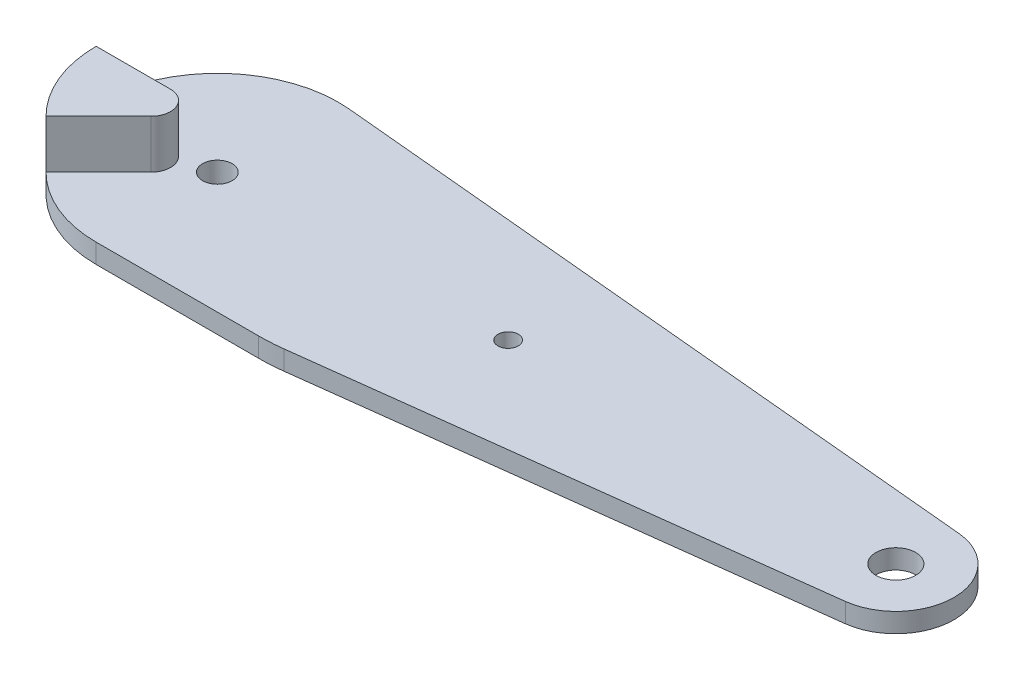
ISO-10303-21;
HEADER;
FILE_DESCRIPTION(('STEP AP214'),'2;1');
FILE_NAME('part.step','',(''),(''),'','','');
FILE_SCHEMA(('AUTOMOTIVE_DESIGN { 1 0 10303 214 1 1 1 1 }'));
ENDSEC;
DATA;
#1=APPLICATION_CONTEXT('core data for automotive mechanical design processes');
#2=APPLICATION_PROTOCOL_DEFINITION('international standard','automotive_design',2000,#1);
#3=PRODUCT_CONTEXT('',#1,'mechanical');
#4=PRODUCT('Part','Part','',(#3));
#5=PRODUCT_RELATED_PRODUCT_CATEGORY('part','',(#4));
#6=PRODUCT_DEFINITION_FORMATION('','',#4);
#7=PRODUCT_DEFINITION_CONTEXT('part definition',#1,'design');
#8=PRODUCT_DEFINITION('design','',#6,#7);
#9=PRODUCT_DEFINITION_SHAPE('','',#8);
#10=(LENGTH_UNIT() NAMED_UNIT(*) SI_UNIT(.MILLI.,.METRE.));
#11=(NAMED_UNIT(*) PLANE_ANGLE_UNIT() SI_UNIT($,.RADIAN.));
#12=(NAMED_UNIT(*) SI_UNIT($,.STERADIAN.) SOLID_ANGLE_UNIT());
#13=UNCERTAINTY_MEASURE_WITH_UNIT(LENGTH_MEASURE(1.E-05),#10,'distance_accuracy_value','');
#14=(GEOMETRIC_REPRESENTATION_CONTEXT(3) GLOBAL_UNCERTAINTY_ASSIGNED_CONTEXT((#13)) GLOBAL_UNIT_ASSIGNED_CONTEXT((#10,
#11,#12)) REPRESENTATION_CONTEXT('',''));
#15=CARTESIAN_POINT('',(0.,0.,0.));
#16=DIRECTION('',(0.,0.,1.));
#17=DIRECTION('',(1.,0.,0.));
#18=AXIS2_PLACEMENT_3D('',#15,#16,#17);
#19=CARTESIAN_POINT('',(0.,0.,0.));
#20=DIRECTION('',(0.,1.,0.));
#21=DIRECTION('',(0.,0.,1.));
#22=AXIS2_PLACEMENT_3D('',#19,#20,#21);
#23=PLANE('',#22);
#24=CARTESIAN_POINT('',(0.,0.,0.));
#25=DIRECTION('',(0.,1.,0.));
#26=DIRECTION('',(0.,0.,1.));
#27=AXIS2_PLACEMENT_3D('',#24,#25,#26);
#28=CIRCLE('',#27,3.05);
#29=CARTESIAN_POINT('',(0.,0.,3.05));
#30=VERTEX_POINT('',#29);
#31=EDGE_CURVE('E205',#30,#30,#28,.T.);
#32=ORIENTED_EDGE('',*,*,#31,.T.);
#33=EDGE_LOOP('',(#32));
#34=FACE_BOUND('',#33,.T.);
#35=CARTESIAN_POINT('',(0.,0.,0.));
#36=DIRECTION('',(0.,1.,0.));
#37=DIRECTION('',(0.,0.,1.));
#38=AXIS2_PLACEMENT_3D('',#35,#36,#37);
#39=CIRCLE('',#38,12.5);
#40=CARTESIAN_POINT('',(5.93717104351897,0.,11.));
#41=VERTEX_POINT('',#40);
#42=CARTESIAN_POINT('',(5.93717104351896,0.,-11.));
#43=VERTEX_POINT('',#42);
#44=EDGE_CURVE('E201',#41,#43,#39,.T.);
#45=ORIENTED_EDGE('',*,*,#44,.F.);
#46=DIRECTION('',(1.,0.,0.));
#47=VECTOR('',#46,1.);
#48=CARTESIAN_POINT('',(0.,0.,11.));
#49=LINE('',#48,#47);
#50=CARTESIAN_POINT('',(-5.93717104351897,0.,11.));
#51=VERTEX_POINT('',#50);
#52=EDGE_CURVE('E188',#51,#41,#49,.T.);
#53=ORIENTED_EDGE('',*,*,#52,.F.);
#54=CARTESIAN_POINT('',(-5.93717104351896,0.,-11.));
#55=VERTEX_POINT('',#54);
#56=EDGE_CURVE('E199',#55,#51,#39,.T.);
#57=ORIENTED_EDGE('',*,*,#56,.F.);
#58=DIRECTION('',(1.,0.,0.));
#59=VECTOR('',#58,1.);
#60=CARTESIAN_POINT('',(0.,0.,-11.));
#61=LINE('',#60,#59);
#62=EDGE_CURVE('E448',#55,#43,#61,.T.);
#63=ORIENTED_EDGE('',*,*,#62,.T.);
#64=EDGE_LOOP('',(#45,#53,#57,#63));
#65=FACE_BOUND('',#64,.T.);
#66=ADVANCED_FACE('F83',(#34,#65),#23,.F.);
#67=CARTESIAN_POINT('',(0.,8.,0.));
#68=DIRECTION('',(0.,-1.,0.));
#69=DIRECTION('',(0.,0.,-1.));
#70=AXIS2_PLACEMENT_3D('',#67,#68,#69);
#71=CYLINDRICAL_SURFACE('',#70,12.5);
#72=CARTESIAN_POINT('',(0.,6.,0.));
#73=DIRECTION('',(0.,-1.,0.));
#74=DIRECTION('',(0.,0.,-1.));
#75=AXIS2_PLACEMENT_3D('',#72,#73,#74);
#76=CIRCLE('',#75,12.5);
#77=CARTESIAN_POINT('',(5.93717104351896,6.,-11.));
#78=VERTEX_POINT('',#77);
#79=CARTESIAN_POINT('',(5.93717104351897,6.,11.));
#80=VERTEX_POINT('',#79);
#81=EDGE_CURVE('E374',#78,#80,#76,.T.);
#82=ORIENTED_EDGE('',*,*,#81,.T.);
#83=DIRECTION('',(0.,-1.,0.));
#84=VECTOR('',#83,1.);
#85=CARTESIAN_POINT('',(5.93717104351897,17.9687092035858,11.));
#86=LINE('',#85,#84);
#87=EDGE_CURVE('E193',#80,#41,#86,.T.);
#88=ORIENTED_EDGE('',*,*,#87,.T.);
#89=ORIENTED_EDGE('',*,*,#44,.T.);
#90=DIRECTION('',(0.,-1.,0.));
#91=VECTOR('',#90,1.);
#92=CARTESIAN_POINT('',(5.93717104351897,17.9687092035858,-11.));
#93=LINE('',#92,#91);
#94=EDGE_CURVE('E447',#78,#43,#93,.T.);
#95=ORIENTED_EDGE('',*,*,#94,.F.);
#96=EDGE_LOOP('',(#82,#88,#89,#95));
#97=FACE_BOUND('',#96,.T.);
#98=ADVANCED_FACE('F300',(#97),#71,.T.);
#99=ORIENTED_EDGE('',*,*,#56,.T.);
#100=DIRECTION('',(0.,-1.,0.));
#101=VECTOR('',#100,1.);
#102=CARTESIAN_POINT('',(-5.93717104351896,17.9687092035858,11.));
#103=LINE('',#102,#101);
#104=CARTESIAN_POINT('',(-5.93717104351897,6.,11.));
#105=VERTEX_POINT('',#104);
#106=EDGE_CURVE('E184',#105,#51,#103,.T.);
#107=ORIENTED_EDGE('',*,*,#106,.F.);
#108=CARTESIAN_POINT('',(-5.93717104351896,6.,-11.));
#109=VERTEX_POINT('',#108);
#110=EDGE_CURVE('E373',#105,#109,#76,.T.);
#111=ORIENTED_EDGE('',*,*,#110,.T.);
#112=DIRECTION('',(0.,-1.,0.));
#113=VECTOR('',#112,1.);
#114=CARTESIAN_POINT('',(-5.93717104351896,17.9687092035858,-11.));
#115=LINE('',#114,#113);
#116=EDGE_CURVE('E99',#109,#55,#115,.T.);
#117=ORIENTED_EDGE('',*,*,#116,.T.);
#118=EDGE_LOOP('',(#99,#107,#111,#117));
#119=FACE_BOUND('',#118,.T.);
#120=ADVANCED_FACE('F204',(#119),#71,.T.);
#121=CARTESIAN_POINT('',(0.,3.3,-12.5));
#122=DIRECTION('',(0.,0.,1.));
#123=DIRECTION('',(1.,0.,0.));
#124=AXIS2_PLACEMENT_3D('',#121,#122,#123);
#125=CYLINDRICAL_SURFACE('',#124,1.6);
#126=CARTESIAN_POINT('',(0.,4.9,-3.05));
#127=CARTESIAN_POINT('',(-0.0836110050453581,4.89999455650102,-3.04999517700509));
#128=CARTESIAN_POINT('',(-0.167306428380569,4.89340785872216,-3.04652589814843));
#129=CARTESIAN_POINT('',(-0.332191821665101,4.86736761047759,-3.03298901559862));
#130=CARTESIAN_POINT('',(-0.41337744453983,4.84789291591933,-3.02291056912914));
#131=CARTESIAN_POINT('',(-0.570613153127324,4.79706399807992,-2.99720260155738));
#132=CARTESIAN_POINT('',(-0.64668239885405,4.76575738147327,-2.98159534164387));
#133=CARTESIAN_POINT('',(-0.792357900481189,4.69241738866397,-2.94623419512776));
#134=CARTESIAN_POINT('',(-0.861964263345972,4.65038419003549,-2.92648037717069));
#135=CARTESIAN_POINT('',(-0.997798318782131,4.55371076067794,-2.88310679073146));
#136=CARTESIAN_POINT('',(-1.06351666988197,4.49843117858787,-2.859319653945));
#137=CARTESIAN_POINT('',(-1.18522587445246,4.37822360035397,-2.81105572902165));
#138=CARTESIAN_POINT('',(-1.24120850706307,4.31328753525379,-2.78657837813787));
#139=CARTESIAN_POINT('',(-1.3467876012229,4.16882083429099,-2.73721560194913));
#140=CARTESIAN_POINT('',(-1.39539667719393,4.08851034451157,-2.71248186972032));
#141=CARTESIAN_POINT('',(-1.47821785577007,3.91944545804245,-2.66825595257666));
#142=CARTESIAN_POINT('',(-1.51244089981633,3.83069754174642,-2.64875978826508));
#143=CARTESIAN_POINT('',(-1.56317686282866,3.65282461369515,-2.61912187860583));
#144=CARTESIAN_POINT('',(-1.5806560469441,3.56406395204097,-2.60847521031483));
#145=CARTESIAN_POINT('',(-1.60032679539884,3.38428674524895,-2.59645976696876));
#146=CARTESIAN_POINT('',(-1.60253644934951,3.29327299770229,-2.59508001357605));
#147=CARTESIAN_POINT('',(-1.59231112345977,3.12481316320863,-2.60135681056238));
#148=CARTESIAN_POINT('',(-1.58181195806415,3.04719343145767,-2.60781918576659));
#149=CARTESIAN_POINT('',(-1.54985517155484,2.89503685895057,-2.62693591844801));
#150=CARTESIAN_POINT('',(-1.52839341169479,2.82050119402981,-2.63959261441304));
#151=CARTESIAN_POINT('',(-1.47477217782312,2.67451021239191,-2.66992681382473));
#152=CARTESIAN_POINT('',(-1.44237993660731,2.60316388490232,-2.68771221954179));
#153=CARTESIAN_POINT('',(-1.36800477135078,2.46656234914093,-2.7263193459757));
#154=CARTESIAN_POINT('',(-1.32601756253087,2.40130988056908,-2.74714242170351));
#155=CARTESIAN_POINT('',(-1.22673326593071,2.26903155683991,-2.79303030943981));
#156=CARTESIAN_POINT('',(-1.16811065163519,2.20306057289718,-2.81827847110633));
#157=CARTESIAN_POINT('',(-1.04059337899233,2.08142080073434,-2.86781214667249));
#158=CARTESIAN_POINT('',(-0.971692869974616,2.02575792109897,-2.89209710223632));
#159=CARTESIAN_POINT('',(-0.820740647513362,1.9233543393171,-2.93861464263574));
#160=CARTESIAN_POINT('',(-0.738169212285077,1.87728596283712,-2.96065672738557));
#161=CARTESIAN_POINT('',(-0.565004905102359,1.80008897506982,-2.99851580446222));
#162=CARTESIAN_POINT('',(-0.474419068631023,1.76894741136602,-3.01433819164323));
#163=CARTESIAN_POINT('',(-0.296343036097651,1.72525207958017,-3.03677685758856));
#164=CARTESIAN_POINT('',(-0.209283174619134,1.71130246738174,-3.04408137162577));
#165=CARTESIAN_POINT('',(-0.0337678143322872,1.6979411600416,-3.05107459307041));
#166=CARTESIAN_POINT('',(0.0546868918974523,1.69852148648514,-3.05076748003652));
#167=CARTESIAN_POINT('',(0.222261120633014,1.71347654786282,-3.04294690530863));
#168=CARTESIAN_POINT('',(0.301522473378709,1.72664490565815,-3.03606369806689));
#169=CARTESIAN_POINT('',(0.456527872639768,1.76443893700297,-3.01665136822864));
#170=CARTESIAN_POINT('',(0.532271546832611,1.78906582033417,-3.00412164948249));
#171=CARTESIAN_POINT('',(0.680409637622107,1.84961542063141,-2.97412294261102));
#172=CARTESIAN_POINT('',(0.752665352454752,1.88581575597123,-2.95653375763504));
#173=CARTESIAN_POINT('',(0.890294387704052,1.9681537821101,-2.91804565699983));
#174=CARTESIAN_POINT('',(0.955664928691706,2.01429546334583,-2.89714541318244));
#175=CARTESIAN_POINT('',(1.08498511623705,2.12078716825915,-2.85140171616678));
#176=CARTESIAN_POINT('',(1.14806026144041,2.18212172109822,-2.82637478821565));
#177=CARTESIAN_POINT('',(1.26345922508927,2.31441119365977,-2.77671130755486));
#178=CARTESIAN_POINT('',(1.31577375066828,2.38537434160053,-2.7520751090808));
#179=CARTESIAN_POINT('',(1.41129657900498,2.5403745197948,-2.70439793263665));
#180=CARTESIAN_POINT('',(1.45373748753615,2.62494981651054,-2.6815510703486));
#181=CARTESIAN_POINT('',(1.52334205942745,2.80159483835205,-2.64263875687894));
#182=CARTESIAN_POINT('',(1.55052704827709,2.89365389503911,-2.62656384740357));
#183=CARTESIAN_POINT('',(1.58620051535253,3.07307748344927,-2.60516086699517));
#184=CARTESIAN_POINT('',(1.59625878046835,3.16001932668319,-2.59893477717467));
#185=CARTESIAN_POINT('',(1.60200350958647,3.33453714083777,-2.59540043680358));
#186=CARTESIAN_POINT('',(1.59769866270163,3.42211269639874,-2.5980867945703));
#187=CARTESIAN_POINT('',(1.57634037251977,3.58479140400219,-2.6110861836083));
#188=CARTESIAN_POINT('',(1.56080020023768,3.66017609553527,-2.62049247072563));
#189=CARTESIAN_POINT('',(1.51941962429058,3.8071449722835,-2.64469943748282));
#190=CARTESIAN_POINT('',(1.49357556899147,3.87872779993836,-2.65950202938117));
#191=CARTESIAN_POINT('',(1.43045670677683,4.0212953716003,-2.69400519922494));
#192=CARTESIAN_POINT('',(1.39254346462314,4.09193309027499,-2.71396330851015));
#193=CARTESIAN_POINT('',(1.30701559790143,4.22631627316641,-2.7561720524641));
#194=CARTESIAN_POINT('',(1.25939575644108,4.29005800275725,-2.7784239167382));
#195=CARTESIAN_POINT('',(1.14810442822523,4.41803657579401,-2.82639569886052));
#196=CARTESIAN_POINT('',(1.08312351653135,4.48112091253597,-2.85216935720769));
#197=CARTESIAN_POINT('',(0.942903791930801,4.59581536913892,-2.9015436493127));
#198=CARTESIAN_POINT('',(0.867658720167137,4.6474184370686,-2.92514294236523));
#199=CARTESIAN_POINT('',(0.706919773010004,4.73838586255545,-2.96813330877579));
#200=CARTESIAN_POINT('',(0.621256595958553,4.77749570553711,-2.98743470182243));
#201=CARTESIAN_POINT('',(0.443338336959858,4.84022493559491,-3.01894839595394));
#202=CARTESIAN_POINT('',(0.35110195214757,4.86388645600461,-3.03117996852047));
#203=CARTESIAN_POINT('',(0.214843288011331,4.8860963019435,-3.04272489307524));
#204=CARTESIAN_POINT('',(0.172094969544414,4.89130106575374,-3.04544427350963));
#205=CARTESIAN_POINT('',(0.0862385933399973,4.898254353152,-3.04908308883221));
#206=CARTESIAN_POINT('',(0.0431305284664786,4.90000280801538,-3.0500024879299));
#207=CARTESIAN_POINT('',(0.,4.9,-3.05));
#208=B_SPLINE_CURVE_WITH_KNOTS('',3,(#126,#127,#128,#129,#130,#131,#132,#133,#134,#135,#136,
#137,#138,#139,#140,#141,#142,#143,#144,#145,#146,#147,#148,#149,#150,#151,#152,#153,#154,#155,
#156,#157,#158,#159,#160,#161,#162,#163,#164,#165,#166,#167,#168,#169,#170,#171,#172,#173,#174,
#175,#176,#177,#178,#179,#180,#181,#182,#183,#184,#185,#186,#187,#188,#189,#190,#191,#192,#193,
#194,#195,#196,#197,#198,#199,#200,#201,#202,#203,#204,#205,#206,#207),.UNSPECIFIED.,.T.,.F.,(4,
2,2,2,2,2,2,2,2,2,2,2,2,2,2,2,2,2,2,2,2,2,2,2,2,2,2,2,2,2,2,2,2,2,2,2,2,2,2,2,4),(0.,
0.250658754208306,0.501729762912424,0.751801140503482,1.00186837853366,1.26810210223369,
1.53455955403315,1.82433168016992,2.1138830166977,2.38548666885169,2.65676850048792,
2.89144544038274,3.12621104423379,3.36632969040414,3.60655577548953,3.88076383655907,
4.15512858991027,4.44482381121525,4.73426719867742,4.99821133082684,5.26201053397124,
5.50282368426325,5.74366226518102,5.99077646561658,6.23799004262053,6.51123596988036,
6.78471689052737,7.07518363207381,7.36524332677427,7.62690724924094,7.88841290412563,
8.12003101787473,8.35173128875636,8.5986251672399,8.84565209243475,9.12686877824567,
9.40825771675036,9.69505938135874,9.98107552659207,10.1103746489914,10.2396763423257),.UNSPECIFIED.);
#209=CARTESIAN_POINT('',(0.,4.9,-3.05));
#210=VERTEX_POINT('',#209);
#211=EDGE_CURVE('E209',#210,#210,#208,.T.);
#212=ORIENTED_EDGE('',*,*,#211,.T.);
#213=EDGE_LOOP('',(#212));
#214=FACE_BOUND('',#213,.T.);
#215=CARTESIAN_POINT('',(0.,3.3,-11.));
#216=DIRECTION('',(0.,0.,-1.));
#217=DIRECTION('',(0.,1.,0.));
#218=AXIS2_PLACEMENT_3D('',#215,#216,#217);
#219=CIRCLE('',#218,1.6);
#220=CARTESIAN_POINT('',(0.,4.9,-11.));
#221=VERTEX_POINT('',#220);
#222=EDGE_CURVE('E87',#221,#221,#219,.F.);
#223=ORIENTED_EDGE('',*,*,#222,.F.);
#224=EDGE_LOOP('',(#223));
#225=FACE_BOUND('',#224,.T.);
#226=ADVANCED_FACE('F229',(#214,#225),#125,.F.);
#227=CARTESIAN_POINT('',(0.,12.,0.));
#228=DIRECTION('',(0.,-1.,0.));
#229=DIRECTION('',(0.,0.,-1.));
#230=AXIS2_PLACEMENT_3D('',#227,#228,#229);
#231=PLANE('',#230);
#232=CARTESIAN_POINT('',(0.,12.,0.));
#233=DIRECTION('',(0.,-1.,0.));
#234=DIRECTION('',(0.,0.,-1.));
#235=AXIS2_PLACEMENT_3D('',#232,#233,#234);
#236=CIRCLE('',#235,3.05);
#237=CARTESIAN_POINT('',(0.,12.,-3.05));
#238=VERTEX_POINT('',#237);
#239=EDGE_CURVE('E359',#238,#238,#236,.F.);
#240=ORIENTED_EDGE('',*,*,#239,.F.);
#241=EDGE_LOOP('',(#240));
#242=FACE_BOUND('',#241,.T.);
#243=CARTESIAN_POINT('',(140.,12.,0.));
#244=DIRECTION('',(0.,1.,0.));
#245=DIRECTION('',(0.,0.,1.));
#246=AXIS2_PLACEMENT_3D('',#243,#244,#245);
#247=CIRCLE('',#246,4.09999999999999);
#248=CARTESIAN_POINT('',(140.,12.,4.09999999999999));
#249=VERTEX_POINT('',#248);
#250=EDGE_CURVE('E378',#249,#249,#247,.T.);
#251=ORIENTED_EDGE('',*,*,#250,.F.);
#252=EDGE_LOOP('',(#251));
#253=FACE_BOUND('',#252,.T.);
#254=CARTESIAN_POINT('',(60.,12.,0.));
#255=DIRECTION('',(0.,1.,0.));
#256=DIRECTION('',(0.,0.,1.));
#257=AXIS2_PLACEMENT_3D('',#254,#255,#256);
#258=CIRCLE('',#257,2.1);
#259=CARTESIAN_POINT('',(60.,12.,2.1));
#260=VERTEX_POINT('',#259);
#261=EDGE_CURVE('E384',#260,#260,#258,.T.);
#262=ORIENTED_EDGE('',*,*,#261,.F.);
#263=EDGE_LOOP('',(#262));
#264=FACE_BOUND('',#263,.T.);
#265=DIRECTION('',(-1.,0.,0.));
#266=VECTOR('',#265,1.);
#267=CARTESIAN_POINT('',(0.,12.,0.));
#268=LINE('',#267,#266);
#269=CARTESIAN_POINT('',(-9.65685424949236,12.,0.));
#270=VERTEX_POINT('',#269);
#271=CARTESIAN_POINT('',(-25.,12.,-1.72084568816899E-13));
#272=VERTEX_POINT('',#271);
#273=EDGE_CURVE('E355',#270,#272,#268,.T.);
#274=ORIENTED_EDGE('',*,*,#273,.F.);
#275=CARTESIAN_POINT('',(-9.65685424949239,12.,3.99999999999993));
#276=DIRECTION('',(0.,-1.,0.));
#277=DIRECTION('',(0.,0.,-1.));
#278=AXIS2_PLACEMENT_3D('',#275,#276,#277);
#279=CIRCLE('',#278,4.);
#280=CARTESIAN_POINT('',(-6.82842712474621,12.,6.82842712474614));
#281=VERTEX_POINT('',#280);
#282=EDGE_CURVE('E12',#270,#281,#279,.T.);
#283=ORIENTED_EDGE('',*,*,#282,.T.);
#284=DIRECTION('',(0.707106781186551,0.,-0.707106781186544));
#285=VECTOR('',#284,1.);
#286=CARTESIAN_POINT('',(0.,12.,0.));
#287=LINE('',#286,#285);
#288=CARTESIAN_POINT('',(-17.6776695296638,12.,17.6776695296636));
#289=VERTEX_POINT('',#288);
#290=EDGE_CURVE('E352',#289,#281,#287,.T.);
#291=ORIENTED_EDGE('',*,*,#290,.F.);
#292=CARTESIAN_POINT('',(0.,12.,0.));
#293=DIRECTION('',(0.,-1.,0.));
#294=DIRECTION('',(0.,0.,-1.));
#295=AXIS2_PLACEMENT_3D('',#292,#293,#294);
#296=CIRCLE('',#295,25.);
#297=CARTESIAN_POINT('',(0.,12.,25.));
#298=VERTEX_POINT('',#297);
#299=EDGE_CURVE('E390',#298,#289,#296,.T.);
#300=ORIENTED_EDGE('',*,*,#299,.F.);
#301=DIRECTION('',(1.,0.,0.));
#302=VECTOR('',#301,1.);
#303=CARTESIAN_POINT('',(0.,12.,25.));
#304=LINE('',#303,#302);
#305=CARTESIAN_POINT('',(33.5271931052562,12.,25.));
#306=VERTEX_POINT('',#305);
#307=EDGE_CURVE('E400',#298,#306,#304,.T.);
#308=ORIENTED_EDGE('',*,*,#307,.T.);
#309=CARTESIAN_POINT('',(33.5271931052562,12.,-15.));
#310=DIRECTION('',(0.,-1.,0.));
#311=DIRECTION('',(0.,0.,-1.));
#312=AXIS2_PLACEMENT_3D('',#309,#310,#311);
#313=CIRCLE('',#312,40.);
#314=CARTESIAN_POINT('',(38.4539780346888,12.,24.6954253064395));
#315=VERTEX_POINT('',#314);
#316=EDGE_CURVE('E322',#306,#315,#313,.F.);
#317=ORIENTED_EDGE('',*,*,#316,.T.);
#318=DIRECTION('',(0.992385632660987,0.,-0.123169623235814));
#319=VECTOR('',#318,1.);
#320=CARTESIAN_POINT('',(36.,12.,25.));
#321=LINE('',#320,#319);
#322=CARTESIAN_POINT('',(141.47803547883,12.,11.9086275919318));
#323=VERTEX_POINT('',#322);
#324=EDGE_CURVE('E398',#315,#323,#321,.T.);
#325=ORIENTED_EDGE('',*,*,#324,.T.);
#326=CARTESIAN_POINT('',(140.,12.,0.));
#327=DIRECTION('',(0.,1.,0.));
#328=DIRECTION('',(0.,0.,1.));
#329=AXIS2_PLACEMENT_3D('',#326,#327,#328);
#330=CIRCLE('',#329,12.);
#331=CARTESIAN_POINT('',(141.114285714286,12.,-11.9481533027886));
#332=VERTEX_POINT('',#331);
#333=EDGE_CURVE('E396',#323,#332,#330,.T.);
#334=ORIENTED_EDGE('',*,*,#333,.T.);
#335=DIRECTION('',(0.995679441899052,0.,0.0928571428571428));
#336=VECTOR('',#335,1.);
#337=CARTESIAN_POINT('',(2.32142857142857,12.,-24.8919860474763));
#338=LINE('',#337,#336);
#339=CARTESIAN_POINT('',(2.32142857142857,12.,-24.8919860474763));
#340=VERTEX_POINT('',#339);
#341=EDGE_CURVE('E392',#340,#332,#338,.T.);
#342=ORIENTED_EDGE('',*,*,#341,.F.);
#343=EDGE_CURVE('E393',#272,#340,#296,.T.);
#344=ORIENTED_EDGE('',*,*,#343,.F.);
#345=EDGE_LOOP('',(#274,#283,#291,#300,#308,#317,#325,#334,#342,#344));
#346=FACE_BOUND('',#345,.T.);
#347=ADVANCED_FACE('F233',(#242,#253,#264,#346),#231,.F.);
#348=CARTESIAN_POINT('',(0.,8.,0.));
#349=DIRECTION('',(0.,-1.,0.));
#350=DIRECTION('',(0.,0.,-1.));
#351=AXIS2_PLACEMENT_3D('',#348,#349,#350);
#352=PLANE('',#351);
#353=CARTESIAN_POINT('',(0.,8.,0.));
#354=DIRECTION('',(0.,-1.,0.));
#355=DIRECTION('',(0.,0.,-1.));
#356=AXIS2_PLACEMENT_3D('',#353,#354,#355);
#357=CIRCLE('',#356,18.);
#358=CARTESIAN_POINT('',(0.,8.,-18.));
#359=VERTEX_POINT('',#358);
#360=EDGE_CURVE('E370',#359,#359,#357,.T.);
#361=ORIENTED_EDGE('',*,*,#360,.F.);
#362=EDGE_LOOP('',(#361));
#363=FACE_BOUND('',#362,.T.);
#364=CARTESIAN_POINT('',(60.,8.,0.));
#365=DIRECTION('',(0.,1.,0.));
#366=DIRECTION('',(0.,0.,1.));
#367=AXIS2_PLACEMENT_3D('',#364,#365,#366);
#368=CIRCLE('',#367,2.1);
#369=CARTESIAN_POINT('',(60.,8.,2.1));
#370=VERTEX_POINT('',#369);
#371=EDGE_CURVE('E381',#370,#370,#368,.T.);
#372=ORIENTED_EDGE('',*,*,#371,.T.);
#373=EDGE_LOOP('',(#372));
#374=FACE_BOUND('',#373,.T.);
#375=DIRECTION('',(0.992385632660987,0.,-0.123169623235814));
#376=VECTOR('',#375,1.);
#377=CARTESIAN_POINT('',(36.,8.,25.));
#378=LINE('',#377,#376);
#379=CARTESIAN_POINT('',(38.4539780346888,8.,24.6954253064395));
#380=VERTEX_POINT('',#379);
#381=CARTESIAN_POINT('',(141.47803547883,8.,11.9086275919318));
#382=VERTEX_POINT('',#381);
#383=EDGE_CURVE('E412',#380,#382,#378,.T.);
#384=ORIENTED_EDGE('',*,*,#383,.F.);
#385=CARTESIAN_POINT('',(33.5271931052562,8.,-15.));
#386=DIRECTION('',(0.,-1.,0.));
#387=DIRECTION('',(0.,0.,-1.));
#388=AXIS2_PLACEMENT_3D('',#385,#386,#387);
#389=CIRCLE('',#388,40.);
#390=CARTESIAN_POINT('',(33.5271931052562,8.,25.));
#391=VERTEX_POINT('',#390);
#392=EDGE_CURVE('E432',#380,#391,#389,.T.);
#393=ORIENTED_EDGE('',*,*,#392,.T.);
#394=DIRECTION('',(1.,0.,0.));
#395=VECTOR('',#394,1.);
#396=CARTESIAN_POINT('',(0.,8.,25.));
#397=LINE('',#396,#395);
#398=CARTESIAN_POINT('',(0.,8.,25.));
#399=VERTEX_POINT('',#398);
#400=EDGE_CURVE('E414',#399,#391,#397,.T.);
#401=ORIENTED_EDGE('',*,*,#400,.F.);
#402=CARTESIAN_POINT('',(0.,8.,0.));
#403=DIRECTION('',(0.,-1.,0.));
#404=DIRECTION('',(0.,0.,-1.));
#405=AXIS2_PLACEMENT_3D('',#402,#403,#404);
#406=CIRCLE('',#405,25.);
#407=CARTESIAN_POINT('',(2.32142857142857,8.,-24.8919860474763));
#408=VERTEX_POINT('',#407);
#409=EDGE_CURVE('E387',#399,#408,#406,.T.);
#410=ORIENTED_EDGE('',*,*,#409,.T.);
#411=DIRECTION('',(0.995679441899052,0.,0.0928571428571428));
#412=VECTOR('',#411,1.);
#413=CARTESIAN_POINT('',(2.32142857142857,8.,-24.8919860474763));
#414=LINE('',#413,#412);
#415=CARTESIAN_POINT('',(141.114285714286,8.,-11.9481533027886));
#416=VERTEX_POINT('',#415);
#417=EDGE_CURVE('E406',#408,#416,#414,.T.);
#418=ORIENTED_EDGE('',*,*,#417,.T.);
#419=CARTESIAN_POINT('',(140.,8.,0.));
#420=DIRECTION('',(0.,1.,0.));
#421=DIRECTION('',(0.,0.,1.));
#422=AXIS2_PLACEMENT_3D('',#419,#420,#421);
#423=CIRCLE('',#422,12.);
#424=EDGE_CURVE('E409',#382,#416,#423,.T.);
#425=ORIENTED_EDGE('',*,*,#424,.F.);
#426=EDGE_LOOP('',(#384,#393,#401,#410,#418,#425));
#427=FACE_BOUND('',#426,.T.);
#428=CARTESIAN_POINT('',(140.,8.,0.));
#429=DIRECTION('',(0.,1.,0.));
#430=DIRECTION('',(0.,0.,1.));
#431=AXIS2_PLACEMENT_3D('',#428,#429,#430);
#432=CIRCLE('',#431,4.09999999999999);
#433=CARTESIAN_POINT('',(140.,8.,4.09999999999999));
#434=VERTEX_POINT('',#433);
#435=EDGE_CURVE('E377',#434,#434,#432,.T.);
#436=ORIENTED_EDGE('',*,*,#435,.T.);
#437=EDGE_LOOP('',(#436));
#438=FACE_BOUND('',#437,.T.);
#439=ADVANCED_FACE('F241',(#363,#374,#427,#438),#352,.T.);
#440=CARTESIAN_POINT('',(0.,12.,0.));
#441=DIRECTION('',(0.,-1.,0.));
#442=DIRECTION('',(0.,0.,-1.));
#443=AXIS2_PLACEMENT_3D('',#440,#441,#442);
#444=CYLINDRICAL_SURFACE('',#443,25.);
#445=ORIENTED_EDGE('',*,*,#409,.F.);
#446=DIRECTION('',(0.,-1.,0.));
#447=VECTOR('',#446,1.);
#448=CARTESIAN_POINT('',(0.,12.,25.));
#449=LINE('',#448,#447);
#450=EDGE_CURVE('E221',#298,#399,#449,.T.);
#451=ORIENTED_EDGE('',*,*,#450,.F.);
#452=ORIENTED_EDGE('',*,*,#299,.T.);
#453=DIRECTION('',(0.,-1.,0.));
#454=VECTOR('',#453,1.);
#455=CARTESIAN_POINT('',(-17.6776695296638,22.,17.6776695296636));
#456=LINE('',#455,#454);
#457=CARTESIAN_POINT('',(-17.6776695296638,22.,17.6776695296636));
#458=VERTEX_POINT('',#457);
#459=EDGE_CURVE('E358',#458,#289,#456,.T.);
#460=ORIENTED_EDGE('',*,*,#459,.F.);
#461=CARTESIAN_POINT('',(0.,22.,0.));
#462=DIRECTION('',(0.,1.,0.));
#463=DIRECTION('',(0.,0.,1.));
#464=AXIS2_PLACEMENT_3D('',#461,#462,#463);
#465=CIRCLE('',#464,25.);
#466=CARTESIAN_POINT('',(-25.,22.,-1.72084568816899E-13));
#467=VERTEX_POINT('',#466);
#468=EDGE_CURVE('E361',#467,#458,#465,.T.);
#469=ORIENTED_EDGE('',*,*,#468,.F.);
#470=DIRECTION('',(0.,-1.,0.));
#471=VECTOR('',#470,1.);
#472=CARTESIAN_POINT('',(-25.,22.,-1.72084568816899E-13));
#473=LINE('',#472,#471);
#474=EDGE_CURVE('E346',#467,#272,#473,.T.);
#475=ORIENTED_EDGE('',*,*,#474,.T.);
#476=ORIENTED_EDGE('',*,*,#343,.T.);
#477=DIRECTION('',(0.,-1.,0.));
#478=VECTOR('',#477,1.);
#479=CARTESIAN_POINT('',(2.32142857142857,12.,-24.8919860474763));
#480=LINE('',#479,#478);
#481=EDGE_CURVE('E403',#340,#408,#480,.T.);
#482=ORIENTED_EDGE('',*,*,#481,.T.);
#483=EDGE_LOOP('',(#445,#451,#452,#460,#469,#475,#476,#482));
#484=FACE_BOUND('',#483,.T.);
#485=ADVANCED_FACE('F236',(#484),#444,.T.);
#486=CARTESIAN_POINT('',(0.,12.,25.));
#487=DIRECTION('',(0.,0.,-1.));
#488=DIRECTION('',(-1.,0.,0.));
#489=AXIS2_PLACEMENT_3D('',#486,#487,#488);
#490=PLANE('',#489);
#491=ORIENTED_EDGE('',*,*,#400,.T.);
#492=DIRECTION('',(0.,-1.,0.));
#493=VECTOR('',#492,1.);
#494=CARTESIAN_POINT('',(33.5271931052562,12.,25.));
#495=LINE('',#494,#493);
#496=EDGE_CURVE('E326',#391,#306,#495,.F.);
#497=ORIENTED_EDGE('',*,*,#496,.T.);
#498=ORIENTED_EDGE('',*,*,#307,.F.);
#499=ORIENTED_EDGE('',*,*,#450,.T.);
#500=EDGE_LOOP('',(#491,#497,#498,#499));
#501=FACE_BOUND('',#500,.T.);
#502=ADVANCED_FACE('F240',(#501),#490,.F.);
#503=CARTESIAN_POINT('',(36.,12.,25.));
#504=DIRECTION('',(-0.123169623235814,0.,-0.992385632660987));
#505=DIRECTION('',(-0.992385632660987,0.,0.123169623235814));
#506=AXIS2_PLACEMENT_3D('',#503,#504,#505);
#507=PLANE('',#506);
#508=ORIENTED_EDGE('',*,*,#324,.F.);
#509=DIRECTION('',(0.,-1.,0.));
#510=VECTOR('',#509,1.);
#511=CARTESIAN_POINT('',(38.4539780346888,12.,24.6954253064395));
#512=LINE('',#511,#510);
#513=EDGE_CURVE('E207',#315,#380,#512,.T.);
#514=ORIENTED_EDGE('',*,*,#513,.T.);
#515=ORIENTED_EDGE('',*,*,#383,.T.);
#516=DIRECTION('',(0.,-1.,0.));
#517=VECTOR('',#516,1.);
#518=CARTESIAN_POINT('',(141.47803547883,12.,11.9086275919318));
#519=LINE('',#518,#517);
#520=EDGE_CURVE('E418',#323,#382,#519,.T.);
#521=ORIENTED_EDGE('',*,*,#520,.F.);
#522=EDGE_LOOP('',(#508,#514,#515,#521));
#523=FACE_BOUND('',#522,.T.);
#524=ADVANCED_FACE('F251',(#523),#507,.F.);
#525=CARTESIAN_POINT('',(140.,12.,0.));
#526=DIRECTION('',(0.,-1.,0.));
#527=DIRECTION('',(0.,0.,-1.));
#528=AXIS2_PLACEMENT_3D('',#525,#526,#527);
#529=CYLINDRICAL_SURFACE('',#528,12.);
#530=ORIENTED_EDGE('',*,*,#424,.T.);
#531=DIRECTION('',(0.,-1.,0.));
#532=VECTOR('',#531,1.);
#533=CARTESIAN_POINT('',(141.114285714286,12.,-11.9481533027886));
#534=LINE('',#533,#532);
#535=EDGE_CURVE('E421',#332,#416,#534,.T.);
#536=ORIENTED_EDGE('',*,*,#535,.F.);
#537=ORIENTED_EDGE('',*,*,#333,.F.);
#538=ORIENTED_EDGE('',*,*,#520,.T.);
#539=EDGE_LOOP('',(#530,#536,#537,#538));
#540=FACE_BOUND('',#539,.T.);
#541=ADVANCED_FACE('F247',(#540),#529,.T.);
#542=CARTESIAN_POINT('',(2.32142857142857,12.,-24.8919860474763));
#543=DIRECTION('',(0.0928571428571428,0.,-0.995679441899052));
#544=DIRECTION('',(-0.995679441899052,0.,-0.0928571428571428));
#545=AXIS2_PLACEMENT_3D('',#542,#543,#544);
#546=PLANE('',#545);
#547=ORIENTED_EDGE('',*,*,#417,.F.);
#548=ORIENTED_EDGE('',*,*,#481,.F.);
#549=ORIENTED_EDGE('',*,*,#341,.T.);
#550=ORIENTED_EDGE('',*,*,#535,.T.);
#551=EDGE_LOOP('',(#547,#548,#549,#550));
#552=FACE_BOUND('',#551,.T.);
#553=ADVANCED_FACE('F243',(#552),#546,.T.);
#554=CARTESIAN_POINT('',(60.,12.,0.));
#555=DIRECTION('',(0.,-1.,0.));
#556=DIRECTION('',(0.,0.,-1.));
#557=AXIS2_PLACEMENT_3D('',#554,#555,#556);
#558=CYLINDRICAL_SURFACE('',#557,2.1);
#559=ORIENTED_EDGE('',*,*,#261,.T.);
#560=EDGE_LOOP('',(#559));
#561=FACE_BOUND('',#560,.T.);
#562=ORIENTED_EDGE('',*,*,#371,.F.);
#563=EDGE_LOOP('',(#562));
#564=FACE_BOUND('',#563,.T.);
#565=ADVANCED_FACE('F246',(#561,#564),#558,.F.);
#566=CARTESIAN_POINT('',(140.,12.,0.));
#567=DIRECTION('',(0.,-1.,0.));
#568=DIRECTION('',(0.,0.,-1.));
#569=AXIS2_PLACEMENT_3D('',#566,#567,#568);
#570=CYLINDRICAL_SURFACE('',#569,4.09999999999999);
#571=ORIENTED_EDGE('',*,*,#250,.T.);
#572=EDGE_LOOP('',(#571));
#573=FACE_BOUND('',#572,.T.);
#574=ORIENTED_EDGE('',*,*,#435,.F.);
#575=EDGE_LOOP('',(#574));
#576=FACE_BOUND('',#575,.T.);
#577=ADVANCED_FACE('F267',(#573,#576),#570,.F.);
#578=CARTESIAN_POINT('',(0.,6.,0.));
#579=DIRECTION('',(0.,1.,0.));
#580=DIRECTION('',(0.,0.,1.));
#581=AXIS2_PLACEMENT_3D('',#578,#579,#580);
#582=CYLINDRICAL_SURFACE('',#581,18.);
#583=CARTESIAN_POINT('',(0.,7.,0.));
#584=DIRECTION('',(0.,-1.,0.));
#585=DIRECTION('',(0.,0.,-1.));
#586=AXIS2_PLACEMENT_3D('',#583,#584,#585);
#587=CIRCLE('',#586,18.);
#588=CARTESIAN_POINT('',(0.,7.,-18.));
#589=VERTEX_POINT('',#588);
#590=EDGE_CURVE('E318',#589,#589,#587,.F.);
#591=ORIENTED_EDGE('',*,*,#590,.T.);
#592=EDGE_LOOP('',(#591));
#593=FACE_BOUND('',#592,.T.);
#594=ORIENTED_EDGE('',*,*,#360,.T.);
#595=EDGE_LOOP('',(#594));
#596=FACE_BOUND('',#595,.T.);
#597=ADVANCED_FACE('F271',(#593,#596),#582,.T.);
#598=CARTESIAN_POINT('',(0.,6.,0.));
#599=DIRECTION('',(0.,-1.,0.));
#600=DIRECTION('',(0.,0.,-1.));
#601=AXIS2_PLACEMENT_3D('',#598,#599,#600);
#602=PLANE('',#601);
#603=CARTESIAN_POINT('',(0.,6.,0.));
#604=DIRECTION('',(0.,-1.,0.));
#605=DIRECTION('',(0.,0.,-1.));
#606=AXIS2_PLACEMENT_3D('',#603,#604,#605);
#607=CIRCLE('',#606,17.);
#608=CARTESIAN_POINT('',(0.,6.,-17.));
#609=VERTEX_POINT('',#608);
#610=EDGE_CURVE('E321',#609,#609,#607,.T.);
#611=ORIENTED_EDGE('',*,*,#610,.T.);
#612=EDGE_LOOP('',(#611));
#613=FACE_BOUND('',#612,.T.);
#614=ORIENTED_EDGE('',*,*,#81,.F.);
#615=DIRECTION('',(-1.,0.,0.));
#616=VECTOR('',#615,1.);
#617=CARTESIAN_POINT('',(0.,6.,-11.));
#618=LINE('',#617,#616);
#619=EDGE_CURVE('E202',#78,#109,#618,.T.);
#620=ORIENTED_EDGE('',*,*,#619,.T.);
#621=ORIENTED_EDGE('',*,*,#110,.F.);
#622=DIRECTION('',(-1.,0.,0.));
#623=VECTOR('',#622,1.);
#624=CARTESIAN_POINT('',(0.,6.,11.));
#625=LINE('',#624,#623);
#626=EDGE_CURVE('E107',#80,#105,#625,.T.);
#627=ORIENTED_EDGE('',*,*,#626,.F.);
#628=EDGE_LOOP('',(#614,#620,#621,#627));
#629=FACE_BOUND('',#628,.T.);
#630=ADVANCED_FACE('F275',(#613,#629),#602,.T.);
#631=CARTESIAN_POINT('',(0.,3.3,11.));
#632=DIRECTION('',(0.,0.,-1.));
#633=DIRECTION('',(0.,1.,0.));
#634=AXIS2_PLACEMENT_3D('',#631,#632,#633);
#635=CIRCLE('',#634,1.6);
#636=CARTESIAN_POINT('',(0.,4.9,11.));
#637=VERTEX_POINT('',#636);
#638=EDGE_CURVE('E364',#637,#637,#635,.F.);
#639=ORIENTED_EDGE('',*,*,#638,.T.);
#640=EDGE_LOOP('',(#639));
#641=FACE_BOUND('',#640,.T.);
#642=CARTESIAN_POINT('',(1.6,3.3,2.59663243451976));
#643=CARTESIAN_POINT('',(1.59999378682515,3.21728336908306,2.5966406247906));
#644=CARTESIAN_POINT('',(1.59354188631742,3.13447730017785,2.60064619812031));
#645=CARTESIAN_POINT('',(1.56808778570973,2.97146003751286,2.61606711195034));
#646=CARTESIAN_POINT('',(1.54906183094383,2.89125405724305,2.62749647663372));
#647=CARTESIAN_POINT('',(1.49954113021347,2.73611025969945,2.65606483262483));
#648=CARTESIAN_POINT('',(1.46911228125232,2.66114505454085,2.6731709543272));
#649=CARTESIAN_POINT('',(1.39785171729525,2.51740588441611,2.71111334628363));
#650=CARTESIAN_POINT('',(1.3570185939043,2.44863275936013,2.73195012143128));
#651=CARTESIAN_POINT('',(1.26174270746287,2.31230720023514,2.77732475161168));
#652=CARTESIAN_POINT('',(1.2063976338372,2.24543976158504,2.80202682426253));
#653=CARTESIAN_POINT('',(1.08553906488092,2.12139518108461,2.85102776361114));
#654=CARTESIAN_POINT('',(1.02002007415775,2.06422331137226,2.8753264044991));
#655=CARTESIAN_POINT('',(0.874594001762126,1.95692417261597,2.92298952190269));
#656=CARTESIAN_POINT('',(0.793971605295546,1.90766343394899,2.94614238355477));
#657=CARTESIAN_POINT('',(0.624140360396243,1.82372044032032,2.98672863161971));
#658=CARTESIAN_POINT('',(0.534937521127975,1.78902807270669,3.00416598360904));
#659=CARTESIAN_POINT('',(0.357754793364664,1.73800023206223,3.0301651066957));
#660=CARTESIAN_POINT('',(0.270209982648431,1.7204565935108,3.03930709015545));
#661=CARTESIAN_POINT('',(0.0929815534821511,1.70022084871031,3.04987117410931));
#662=CARTESIAN_POINT('',(0.00329942358583375,1.69751869301561,3.05129849833305));
#663=CARTESIAN_POINT('',(-0.166470992165667,1.70663315004246,3.04652438501616));
#664=CARTESIAN_POINT('',(-0.246657591129589,1.71708791014774,3.04103845280307));
#665=CARTESIAN_POINT('',(-0.403943321949367,1.74974780240453,3.02416710451348));
#666=CARTESIAN_POINT('',(-0.481042219846809,1.77195382315647,3.01278124230064));
#667=CARTESIAN_POINT('',(-0.631216476791163,1.82756593033537,2.98495847081266));
#668=CARTESIAN_POINT('',(-0.704229177728559,1.86110911478044,2.9684599486628));
#669=CARTESIAN_POINT('',(-0.84375152909156,1.93822029841697,2.93185832553311));
#670=CARTESIAN_POINT('',(-0.910258939934253,1.98179173285538,2.91175398987883));
#671=CARTESIAN_POINT('',(-1.0420767093984,2.08276952377993,2.86738350312404));
#672=CARTESIAN_POINT('',(-1.10658405874401,2.14112999181727,2.8429020690454));
#673=CARTESIAN_POINT('',(-1.22535112595613,2.26750552259633,2.79377055914223));
#674=CARTESIAN_POINT('',(-1.27960158984626,2.33552920771896,2.76912035162433));
#675=CARTESIAN_POINT('',(-1.38033677374473,2.48549077611295,2.72039186197068));
#676=CARTESIAN_POINT('',(-1.4259348336903,2.56808937384454,2.69649488213014));
#677=CARTESIAN_POINT('',(-1.5022571515393,2.74129381735411,2.65473784106264));
#678=CARTESIAN_POINT('',(-1.53299799961659,2.8318905976618,2.63687105303479));
#679=CARTESIAN_POINT('',(-1.57612698279401,3.01087560446415,2.61130430365066));
#680=CARTESIAN_POINT('',(-1.58979923080418,3.09884903226371,2.60289846997844));
#681=CARTESIAN_POINT('',(-1.60228491747857,3.27620915308266,2.59523569234672));
#682=CARTESIAN_POINT('',(-1.6011115924491,3.36559451619968,2.59597059849775));
#683=CARTESIAN_POINT('',(-1.58511760779562,3.53116151483989,2.60575512673595));
#684=CARTESIAN_POINT('',(-1.57203842287316,3.60758553841578,2.61374342596883));
#685=CARTESIAN_POINT('',(-1.53528266022049,3.75697687789921,2.63549991834011));
#686=CARTESIAN_POINT('',(-1.51160214816485,3.82994289935817,2.64927025716985));
#687=CARTESIAN_POINT('',(-1.45322959765201,3.97412724518053,2.68174974411559));
#688=CARTESIAN_POINT('',(-1.41808922937968,4.04511845078683,2.70065357203117));
#689=CARTESIAN_POINT('',(-1.33817326689082,4.18061740055741,2.7411307907777));
#690=CARTESIAN_POINT('',(-1.2933927313099,4.24512179473586,2.76270554825678));
#691=CARTESIAN_POINT('',(-1.18808312943885,4.37537303945404,2.80975656593706));
#692=CARTESIAN_POINT('',(-1.12622238271025,4.44000489064608,2.83535300635257));
#693=CARTESIAN_POINT('',(-0.992222797928377,4.55836747788549,2.88497827981606));
#694=CARTESIAN_POINT('',(-0.920079341070078,4.61209328870607,2.90900640129412));
#695=CARTESIAN_POINT('',(-0.764016103392493,4.70890527722115,2.95391357117099));
#696=CARTESIAN_POINT('',(-0.679757936113717,4.75152098774501,2.97464211339182));
#697=CARTESIAN_POINT('',(-0.503869036284247,4.82152916833658,3.00942232856378));
#698=CARTESIAN_POINT('',(-0.412245486391411,4.84893626838741,3.0234804162913));
#699=CARTESIAN_POINT('',(-0.233826110618687,4.88517875798615,3.04221605889272));
#700=CARTESIAN_POINT('',(-0.147425899826333,4.89555958918265,3.04767218609955));
#701=CARTESIAN_POINT('',(0.0260479196843712,4.9021376125147,3.05112010390249));
#702=CARTESIAN_POINT('',(0.113121224114768,4.89834087802133,3.04911509069557));
#703=CARTESIAN_POINT('',(0.278375642799648,4.87762716063569,3.03831224097488));
#704=CARTESIAN_POINT('',(0.356725325444152,4.86174256106392,3.03004913922829));
#705=CARTESIAN_POINT('',(0.509488368865055,4.81878886006396,3.00813550823658));
#706=CARTESIAN_POINT('',(0.583901213674547,4.79171829666541,2.99448427479002));
#707=CARTESIAN_POINT('',(0.729996027487831,4.72610346469918,2.96233389197478));
#708=CARTESIAN_POINT('',(0.801455830619085,4.68715018499452,2.94366534218138));
#709=CARTESIAN_POINT('',(0.937095714074258,4.59937890150683,2.903337183477));
#710=CARTESIAN_POINT('',(1.00127255803254,4.55055653874344,2.88167625423381));
#711=CARTESIAN_POINT('',(1.12783472436126,4.43837145115244,2.83469928197568));
#712=CARTESIAN_POINT('',(1.18928310383978,4.3740091397267,2.80924080809593));
#713=CARTESIAN_POINT('',(1.30091441212686,4.23569639584213,2.75932420888937));
#714=CARTESIAN_POINT('',(1.35108557375162,4.16173607408739,2.73486715004211));
#715=CARTESIAN_POINT('',(1.44091474306906,4.00183438289632,2.68866860098067));
#716=CARTESIAN_POINT('',(1.47995685069716,3.91548971220009,2.66711237895743));
#717=CARTESIAN_POINT('',(1.54235731824472,3.73599373574798,2.63153054685436));
#718=CARTESIAN_POINT('',(1.56576743275709,3.64286603472091,2.61748011771928));
#719=CARTESIAN_POINT('',(1.58707767458726,3.5071480207924,2.60455933932952));
#720=CARTESIAN_POINT('',(1.59191412242778,3.4659323155885,2.60160020469477));
#721=CARTESIAN_POINT('',(1.59837693418277,3.38315195539119,2.59763464036943));
#722=CARTESIAN_POINT('',(1.60000312378598,3.34158728157245,2.59662831671303));
#723=CARTESIAN_POINT('',(1.6,3.3,2.59663243451976));
#724=B_SPLINE_CURVE_WITH_KNOTS('',3,(#642,#643,#644,#645,#646,#647,#648,#649,#650,#651,#652,
#653,#654,#655,#656,#657,#658,#659,#660,#661,#662,#663,#664,#665,#666,#667,#668,#669,#670,#671,
#672,#673,#674,#675,#676,#677,#678,#679,#680,#681,#682,#683,#684,#685,#686,#687,#688,#689,#690,
#691,#692,#693,#694,#695,#696,#697,#698,#699,#700,#701,#702,#703,#704,#705,#706,#707,#708,#709,
#710,#711,#712,#713,#714,#715,#716,#717,#718,#719,#720,#721,#722,#723),.UNSPECIFIED.,.T.,.F.,(4,
2,2,2,2,2,2,2,2,2,2,2,2,2,2,2,2,2,2,2,2,2,2,2,2,2,2,2,2,2,2,2,2,2,2,2,2,2,2,2,4),(0.,
0.247974327794149,0.49641846829394,0.743448459973143,0.990511909133791,1.26013717956819,
1.52990859667184,1.82019834306389,2.11028625005609,2.37802901354517,2.64559046103043,
2.88760065839093,3.12962915856249,3.3746959054861,3.61984672700968,3.8898191170145,
4.16003393139772,4.45049905898942,4.74063908756624,5.00729439409052,5.27371196762867,
5.50649820104012,5.73937089692823,5.98274290784291,6.22623996486918,6.50418160308525,
6.78224848336147,7.07066562330343,7.35880483613918,7.61895411864547,7.87899197145551,
8.11901424586534,8.35906790036015,8.60855321672455,8.85814896757966,9.13461962967585,
9.41137744883419,9.70134147592946,9.99034066263988,10.1150074699039,10.2396810461654),.UNSPECIFIED.);
#725=CARTESIAN_POINT('',(1.6,3.3,2.59663243451976));
#726=VERTEX_POINT('',#725);
#727=EDGE_CURVE('E213',#726,#726,#724,.T.);
#728=ORIENTED_EDGE('',*,*,#727,.T.);
#729=EDGE_LOOP('',(#728));
#730=FACE_BOUND('',#729,.T.);
#731=ADVANCED_FACE('F235',(#641,#730),#125,.F.);
#732=CARTESIAN_POINT('',(0.,8.,0.));
#733=DIRECTION('',(0.,-1.,0.));
#734=DIRECTION('',(0.,0.,-1.));
#735=AXIS2_PLACEMENT_3D('',#732,#733,#734);
#736=CYLINDRICAL_SURFACE('',#735,3.05);
#737=ORIENTED_EDGE('',*,*,#211,.F.);
#738=EDGE_LOOP('',(#737));
#739=FACE_BOUND('',#738,.T.);
#740=ORIENTED_EDGE('',*,*,#727,.F.);
#741=EDGE_LOOP('',(#740));
#742=FACE_BOUND('',#741,.T.);
#743=ORIENTED_EDGE('',*,*,#31,.F.);
#744=EDGE_LOOP('',(#743));
#745=FACE_BOUND('',#744,.T.);
#746=ORIENTED_EDGE('',*,*,#239,.T.);
#747=EDGE_LOOP('',(#746));
#748=FACE_BOUND('',#747,.T.);
#749=ADVANCED_FACE('F226',(#739,#742,#745,#748),#736,.F.);
#750=CARTESIAN_POINT('',(33.5271931052562,12.,-15.));
#751=DIRECTION('',(0.,-1.,0.));
#752=DIRECTION('',(0.,0.,-1.));
#753=AXIS2_PLACEMENT_3D('',#750,#751,#752);
#754=CYLINDRICAL_SURFACE('',#753,40.);
#755=ORIENTED_EDGE('',*,*,#316,.F.);
#756=ORIENTED_EDGE('',*,*,#496,.F.);
#757=ORIENTED_EDGE('',*,*,#392,.F.);
#758=ORIENTED_EDGE('',*,*,#513,.F.);
#759=EDGE_LOOP('',(#755,#756,#757,#758));
#760=FACE_BOUND('',#759,.T.);
#761=ADVANCED_FACE('F308',(#760),#754,.T.);
#762=CARTESIAN_POINT('',(0.,7.,0.));
#763=DIRECTION('',(0.,-1.,0.));
#764=DIRECTION('',(0.,0.,-1.));
#765=AXIS2_PLACEMENT_3D('',#762,#763,#764);
#766=TOROIDAL_SURFACE('',#765,17.,1.);
#767=ORIENTED_EDGE('',*,*,#590,.F.);
#768=EDGE_LOOP('',(#767));
#769=FACE_BOUND('',#768,.T.);
#770=ORIENTED_EDGE('',*,*,#610,.F.);
#771=EDGE_LOOP('',(#770));
#772=FACE_BOUND('',#771,.T.);
#773=ADVANCED_FACE('F284',(#769,#772),#766,.T.);
#774=CARTESIAN_POINT('',(0.,22.,0.));
#775=DIRECTION('',(-0.707106781186544,0.,-0.707106781186551));
#776=DIRECTION('',(-0.707106781186551,0.,0.707106781186544));
#777=AXIS2_PLACEMENT_3D('',#774,#775,#776);
#778=PLANE('',#777);
#779=ORIENTED_EDGE('',*,*,#290,.T.);
#780=DIRECTION('',(0.,-1.,0.));
#781=VECTOR('',#780,1.);
#782=CARTESIAN_POINT('',(-6.82842712474621,22.,6.82842712474614));
#783=LINE('',#782,#781);
#784=CARTESIAN_POINT('',(-6.82842712474621,22.,6.82842712474614));
#785=VERTEX_POINT('',#784);
#786=EDGE_CURVE('E332',#281,#785,#783,.F.);
#787=ORIENTED_EDGE('',*,*,#786,.T.);
#788=DIRECTION('',(0.707106781186551,0.,-0.707106781186544));
#789=VECTOR('',#788,1.);
#790=CARTESIAN_POINT('',(0.,22.,0.));
#791=LINE('',#790,#789);
#792=EDGE_CURVE('E340',#458,#785,#791,.T.);
#793=ORIENTED_EDGE('',*,*,#792,.F.);
#794=ORIENTED_EDGE('',*,*,#459,.T.);
#795=EDGE_LOOP('',(#779,#787,#793,#794));
#796=FACE_BOUND('',#795,.T.);
#797=ADVANCED_FACE('F280',(#796),#778,.F.);
#798=CARTESIAN_POINT('',(0.,22.,0.));
#799=DIRECTION('',(0.,0.,1.));
#800=DIRECTION('',(1.,0.,0.));
#801=AXIS2_PLACEMENT_3D('',#798,#799,#800);
#802=PLANE('',#801);
#803=DIRECTION('',(-1.,0.,0.));
#804=VECTOR('',#803,1.);
#805=CARTESIAN_POINT('',(0.,22.,0.));
#806=LINE('',#805,#804);
#807=CARTESIAN_POINT('',(-9.65685424949236,22.,0.));
#808=VERTEX_POINT('',#807);
#809=EDGE_CURVE('E338',#808,#467,#806,.T.);
#810=ORIENTED_EDGE('',*,*,#809,.F.);
#811=DIRECTION('',(0.,-1.,0.));
#812=VECTOR('',#811,1.);
#813=CARTESIAN_POINT('',(-9.65685424949236,22.,0.));
#814=LINE('',#813,#812);
#815=EDGE_CURVE('E324',#808,#270,#814,.T.);
#816=ORIENTED_EDGE('',*,*,#815,.T.);
#817=ORIENTED_EDGE('',*,*,#273,.T.);
#818=ORIENTED_EDGE('',*,*,#474,.F.);
#819=EDGE_LOOP('',(#810,#816,#817,#818));
#820=FACE_BOUND('',#819,.T.);
#821=ADVANCED_FACE('F283',(#820),#802,.F.);
#822=CARTESIAN_POINT('',(0.,22.,0.));
#823=DIRECTION('',(0.,1.,0.));
#824=DIRECTION('',(0.,0.,1.));
#825=AXIS2_PLACEMENT_3D('',#822,#823,#824);
#826=PLANE('',#825);
#827=ORIENTED_EDGE('',*,*,#792,.T.);
#828=CARTESIAN_POINT('',(-9.65685424949239,22.,3.99999999999993));
#829=DIRECTION('',(0.,1.,0.));
#830=DIRECTION('',(0.,0.,1.));
#831=AXIS2_PLACEMENT_3D('',#828,#829,#830);
#832=CIRCLE('',#831,4.);
#833=EDGE_CURVE('E92',#785,#808,#832,.T.);
#834=ORIENTED_EDGE('',*,*,#833,.T.);
#835=ORIENTED_EDGE('',*,*,#809,.T.);
#836=ORIENTED_EDGE('',*,*,#468,.T.);
#837=EDGE_LOOP('',(#827,#834,#835,#836));
#838=FACE_BOUND('',#837,.T.);
#839=ADVANCED_FACE('F288',(#838),#826,.T.);
#840=CARTESIAN_POINT('',(-9.65685424949239,22.,3.99999999999993));
#841=DIRECTION('',(0.,-1.,0.));
#842=DIRECTION('',(0.,0.,-1.));
#843=AXIS2_PLACEMENT_3D('',#840,#841,#842);
#844=CYLINDRICAL_SURFACE('',#843,4.);
#845=ORIENTED_EDGE('',*,*,#833,.F.);
#846=ORIENTED_EDGE('',*,*,#786,.F.);
#847=ORIENTED_EDGE('',*,*,#282,.F.);
#848=ORIENTED_EDGE('',*,*,#815,.F.);
#849=EDGE_LOOP('',(#845,#846,#847,#848));
#850=FACE_BOUND('',#849,.T.);
#851=ADVANCED_FACE('F85',(#850),#844,.T.);
#852=CARTESIAN_POINT('',(0.,17.9687092035858,-11.));
#853=DIRECTION('',(0.,0.,-1.));
#854=DIRECTION('',(0.,1.,0.));
#855=AXIS2_PLACEMENT_3D('',#852,#853,#854);
#856=PLANE('',#855);
#857=ORIENTED_EDGE('',*,*,#94,.T.);
#858=ORIENTED_EDGE('',*,*,#62,.F.);
#859=ORIENTED_EDGE('',*,*,#116,.F.);
#860=ORIENTED_EDGE('',*,*,#619,.F.);
#861=EDGE_LOOP('',(#857,#858,#859,#860));
#862=FACE_BOUND('',#861,.T.);
#863=ORIENTED_EDGE('',*,*,#222,.T.);
#864=EDGE_LOOP('',(#863));
#865=FACE_BOUND('',#864,.T.);
#866=ADVANCED_FACE('F293',(#862,#865),#856,.T.);
#867=CARTESIAN_POINT('',(0.,17.9687092035858,11.));
#868=DIRECTION('',(0.,0.,-1.));
#869=DIRECTION('',(0.,1.,0.));
#870=AXIS2_PLACEMENT_3D('',#867,#868,#869);
#871=PLANE('',#870);
#872=ORIENTED_EDGE('',*,*,#626,.T.);
#873=ORIENTED_EDGE('',*,*,#106,.T.);
#874=ORIENTED_EDGE('',*,*,#52,.T.);
#875=ORIENTED_EDGE('',*,*,#87,.F.);
#876=EDGE_LOOP('',(#872,#873,#874,#875));
#877=FACE_BOUND('',#876,.T.);
#878=ORIENTED_EDGE('',*,*,#638,.F.);
#879=EDGE_LOOP('',(#878));
#880=FACE_BOUND('',#879,.T.);
#881=ADVANCED_FACE('F186',(#877,#880),#871,.F.);
#882=CLOSED_SHELL('',(#66,#98,#120,#226,#347,#439,#485,#502,#524,#541,#553,#565,#577,#597,#630,
#731,#749,#761,#773,#797,#821,#839,#851,#866,#881));
#883=MANIFOLD_SOLID_BREP('B2',#882);
#884=ADVANCED_BREP_SHAPE_REPRESENTATION('',(#18,#883),#14);
#885=SHAPE_DEFINITION_REPRESENTATION(#9,#884);
ENDSEC;
END-ISO-10303-21;
